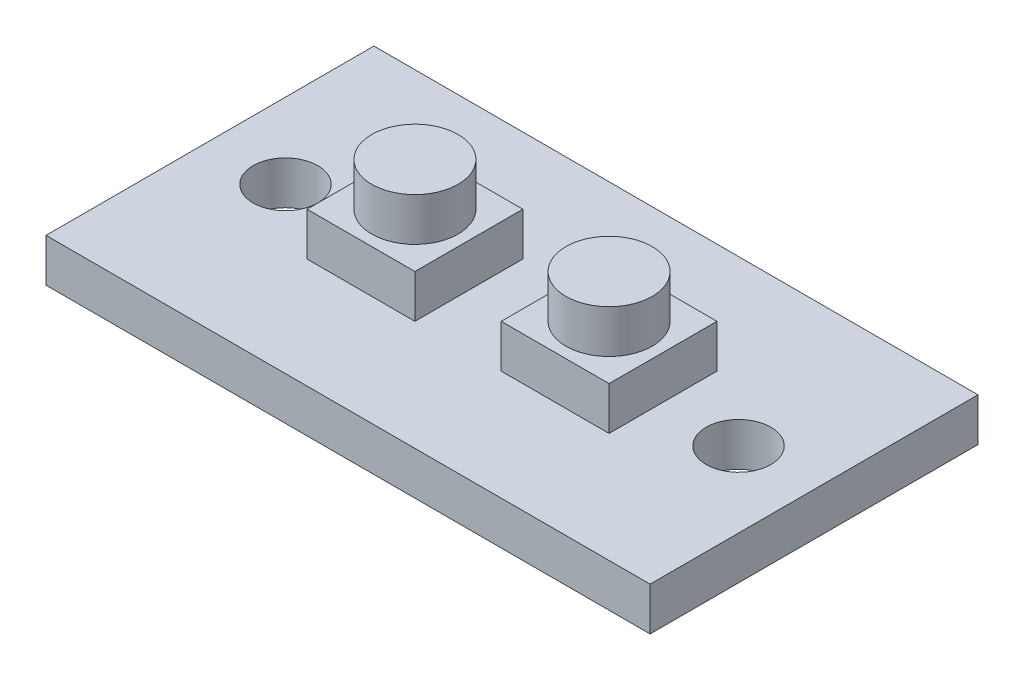
ISO-10303-21;
HEADER;
FILE_DESCRIPTION(('STEP AP214'),'2;1');
FILE_NAME('part.step','',(''),(''),'','','');
FILE_SCHEMA(('AUTOMOTIVE_DESIGN { 1 0 10303 214 1 1 1 1 }'));
ENDSEC;
DATA;
#1=APPLICATION_CONTEXT('core data for automotive mechanical design processes');
#2=APPLICATION_PROTOCOL_DEFINITION('international standard','automotive_design',2000,#1);
#3=PRODUCT_CONTEXT('',#1,'mechanical');
#4=PRODUCT('Part','Part','',(#3));
#5=PRODUCT_RELATED_PRODUCT_CATEGORY('part','',(#4));
#6=PRODUCT_DEFINITION_FORMATION('','',#4);
#7=PRODUCT_DEFINITION_CONTEXT('part definition',#1,'design');
#8=PRODUCT_DEFINITION('design','',#6,#7);
#9=PRODUCT_DEFINITION_SHAPE('','',#8);
#10=(LENGTH_UNIT() NAMED_UNIT(*) SI_UNIT(.MILLI.,.METRE.));
#11=(NAMED_UNIT(*) PLANE_ANGLE_UNIT() SI_UNIT($,.RADIAN.));
#12=(NAMED_UNIT(*) SI_UNIT($,.STERADIAN.) SOLID_ANGLE_UNIT());
#13=UNCERTAINTY_MEASURE_WITH_UNIT(LENGTH_MEASURE(1.E-05),#10,'distance_accuracy_value','');
#14=(GEOMETRIC_REPRESENTATION_CONTEXT(3) GLOBAL_UNCERTAINTY_ASSIGNED_CONTEXT((#13)) GLOBAL_UNIT_ASSIGNED_CONTEXT((#10,
#11,#12)) REPRESENTATION_CONTEXT('',''));
#15=CARTESIAN_POINT('',(0.,0.,0.));
#16=DIRECTION('',(0.,0.,1.));
#17=DIRECTION('',(1.,0.,0.));
#18=AXIS2_PLACEMENT_3D('',#15,#16,#17);
#19=CARTESIAN_POINT('',(0.,2.,0.));
#20=DIRECTION('',(0.,-1.,0.));
#21=DIRECTION('',(0.,0.,-1.));
#22=AXIS2_PLACEMENT_3D('',#19,#20,#21);
#23=PLANE('',#22);
#24=DIRECTION('',(0.,0.,-1.));
#25=VECTOR('',#24,1.);
#26=CARTESIAN_POINT('',(-2.,2.,2.5));
#27=LINE('',#26,#25);
#28=CARTESIAN_POINT('',(-2.,2.,2.5));
#29=VERTEX_POINT('',#28);
#30=CARTESIAN_POINT('',(-2.,2.,-2.5));
#31=VERTEX_POINT('',#30);
#32=EDGE_CURVE('E192',#29,#31,#27,.T.);
#33=ORIENTED_EDGE('',*,*,#32,.F.);
#34=DIRECTION('',(1.,0.,0.));
#35=VECTOR('',#34,1.);
#36=CARTESIAN_POINT('',(-2.,2.,2.5));
#37=LINE('',#36,#35);
#38=CARTESIAN_POINT('',(-7.,2.,2.5));
#39=VERTEX_POINT('',#38);
#40=EDGE_CURVE('E182',#39,#29,#37,.T.);
#41=ORIENTED_EDGE('',*,*,#40,.F.);
#42=DIRECTION('',(0.,0.,1.));
#43=VECTOR('',#42,1.);
#44=CARTESIAN_POINT('',(-7.,2.,2.5));
#45=LINE('',#44,#43);
#46=CARTESIAN_POINT('',(-7.,2.,-2.5));
#47=VERTEX_POINT('',#46);
#48=EDGE_CURVE('E185',#47,#39,#45,.T.);
#49=ORIENTED_EDGE('',*,*,#48,.F.);
#50=DIRECTION('',(-1.,0.,0.));
#51=VECTOR('',#50,1.);
#52=CARTESIAN_POINT('',(-2.,2.,-2.5));
#53=LINE('',#52,#51);
#54=EDGE_CURVE('E189',#31,#47,#53,.T.);
#55=ORIENTED_EDGE('',*,*,#54,.F.);
#56=EDGE_LOOP('',(#33,#41,#49,#55));
#57=FACE_BOUND('',#56,.T.);
#58=DIRECTION('',(0.,0.,-1.));
#59=VECTOR('',#58,1.);
#60=CARTESIAN_POINT('',(14.,2.,7.6));
#61=LINE('',#60,#59);
#62=CARTESIAN_POINT('',(14.,2.,7.6));
#63=VERTEX_POINT('',#62);
#64=CARTESIAN_POINT('',(14.,2.,-7.6));
#65=VERTEX_POINT('',#64);
#66=EDGE_CURVE('E211',#63,#65,#61,.T.);
#67=ORIENTED_EDGE('',*,*,#66,.T.);
#68=DIRECTION('',(-1.,0.,0.));
#69=VECTOR('',#68,1.);
#70=CARTESIAN_POINT('',(-14.,2.,-7.6));
#71=LINE('',#70,#69);
#72=CARTESIAN_POINT('',(-14.,2.,-7.6));
#73=VERTEX_POINT('',#72);
#74=EDGE_CURVE('E214',#65,#73,#71,.T.);
#75=ORIENTED_EDGE('',*,*,#74,.T.);
#76=DIRECTION('',(0.,0.,1.));
#77=VECTOR('',#76,1.);
#78=CARTESIAN_POINT('',(-14.,2.,7.6));
#79=LINE('',#78,#77);
#80=CARTESIAN_POINT('',(-14.,2.,7.6));
#81=VERTEX_POINT('',#80);
#82=EDGE_CURVE('E217',#73,#81,#79,.T.);
#83=ORIENTED_EDGE('',*,*,#82,.T.);
#84=DIRECTION('',(1.,0.,0.));
#85=VECTOR('',#84,1.);
#86=CARTESIAN_POINT('',(-14.,2.,7.6));
#87=LINE('',#86,#85);
#88=EDGE_CURVE('E219',#81,#63,#87,.T.);
#89=ORIENTED_EDGE('',*,*,#88,.T.);
#90=EDGE_LOOP('',(#67,#75,#83,#89));
#91=FACE_BOUND('',#90,.T.);
#92=CARTESIAN_POINT('',(10.5,2.,0.));
#93=DIRECTION('',(0.,1.,0.));
#94=DIRECTION('',(0.,0.,1.));
#95=AXIS2_PLACEMENT_3D('',#92,#93,#94);
#96=CIRCLE('',#95,1.5);
#97=CARTESIAN_POINT('',(10.5,2.,1.5));
#98=VERTEX_POINT('',#97);
#99=EDGE_CURVE('E205',#98,#98,#96,.T.);
#100=ORIENTED_EDGE('',*,*,#99,.F.);
#101=EDGE_LOOP('',(#100));
#102=FACE_BOUND('',#101,.T.);
#103=CARTESIAN_POINT('',(-10.5,2.,0.));
#104=DIRECTION('',(0.,1.,0.));
#105=DIRECTION('',(0.,0.,1.));
#106=AXIS2_PLACEMENT_3D('',#103,#104,#105);
#107=CIRCLE('',#106,1.5);
#108=CARTESIAN_POINT('',(-10.5,2.,1.5));
#109=VERTEX_POINT('',#108);
#110=EDGE_CURVE('E162',#109,#109,#107,.T.);
#111=ORIENTED_EDGE('',*,*,#110,.F.);
#112=EDGE_LOOP('',(#111));
#113=FACE_BOUND('',#112,.T.);
#114=DIRECTION('',(0.,0.,-1.));
#115=VECTOR('',#114,1.);
#116=CARTESIAN_POINT('',(7.,2.,2.5));
#117=LINE('',#116,#115);
#118=CARTESIAN_POINT('',(7.,2.,2.5));
#119=VERTEX_POINT('',#118);
#120=CARTESIAN_POINT('',(7.,2.,-2.5));
#121=VERTEX_POINT('',#120);
#122=EDGE_CURVE('E158',#119,#121,#117,.T.);
#123=ORIENTED_EDGE('',*,*,#122,.F.);
#124=DIRECTION('',(1.,0.,0.));
#125=VECTOR('',#124,1.);
#126=CARTESIAN_POINT('',(2.,2.,2.5));
#127=LINE('',#126,#125);
#128=CARTESIAN_POINT('',(2.,2.,2.5));
#129=VERTEX_POINT('',#128);
#130=EDGE_CURVE('E155',#129,#119,#127,.T.);
#131=ORIENTED_EDGE('',*,*,#130,.F.);
#132=DIRECTION('',(0.,0.,1.));
#133=VECTOR('',#132,1.);
#134=CARTESIAN_POINT('',(2.,2.,2.5));
#135=LINE('',#134,#133);
#136=CARTESIAN_POINT('',(2.,2.,-2.5));
#137=VERTEX_POINT('',#136);
#138=EDGE_CURVE('E69',#137,#129,#135,.T.);
#139=ORIENTED_EDGE('',*,*,#138,.F.);
#140=DIRECTION('',(-1.,0.,0.));
#141=VECTOR('',#140,1.);
#142=CARTESIAN_POINT('',(2.,2.,-2.5));
#143=LINE('',#142,#141);
#144=EDGE_CURVE('E64',#121,#137,#143,.T.);
#145=ORIENTED_EDGE('',*,*,#144,.F.);
#146=EDGE_LOOP('',(#123,#131,#139,#145));
#147=FACE_BOUND('',#146,.T.);
#148=ADVANCED_FACE('F47',(#57,#91,#102,#113,#147),#23,.F.);
#149=CARTESIAN_POINT('',(0.,0.,0.));
#150=DIRECTION('',(0.,-1.,0.));
#151=DIRECTION('',(0.,0.,-1.));
#152=AXIS2_PLACEMENT_3D('',#149,#150,#151);
#153=PLANE('',#152);
#154=CARTESIAN_POINT('',(10.5,0.,0.));
#155=DIRECTION('',(0.,1.,0.));
#156=DIRECTION('',(0.,0.,1.));
#157=AXIS2_PLACEMENT_3D('',#154,#155,#156);
#158=CIRCLE('',#157,1.5);
#159=CARTESIAN_POINT('',(10.5,0.,1.5));
#160=VERTEX_POINT('',#159);
#161=EDGE_CURVE('E203',#160,#160,#158,.T.);
#162=ORIENTED_EDGE('',*,*,#161,.T.);
#163=EDGE_LOOP('',(#162));
#164=FACE_BOUND('',#163,.T.);
#165=DIRECTION('',(0.,0.,-1.));
#166=VECTOR('',#165,1.);
#167=CARTESIAN_POINT('',(14.,0.,7.6));
#168=LINE('',#167,#166);
#169=CARTESIAN_POINT('',(14.,0.,7.6));
#170=VERTEX_POINT('',#169);
#171=CARTESIAN_POINT('',(14.,0.,-7.6));
#172=VERTEX_POINT('',#171);
#173=EDGE_CURVE('E208',#170,#172,#168,.T.);
#174=ORIENTED_EDGE('',*,*,#173,.F.);
#175=DIRECTION('',(1.,0.,0.));
#176=VECTOR('',#175,1.);
#177=CARTESIAN_POINT('',(-14.,0.,7.6));
#178=LINE('',#177,#176);
#179=CARTESIAN_POINT('',(-14.,0.,7.6));
#180=VERTEX_POINT('',#179);
#181=EDGE_CURVE('E215',#180,#170,#178,.T.);
#182=ORIENTED_EDGE('',*,*,#181,.F.);
#183=DIRECTION('',(0.,0.,1.));
#184=VECTOR('',#183,1.);
#185=CARTESIAN_POINT('',(-14.,0.,7.6));
#186=LINE('',#185,#184);
#187=CARTESIAN_POINT('',(-14.,0.,-7.6));
#188=VERTEX_POINT('',#187);
#189=EDGE_CURVE('E226',#188,#180,#186,.T.);
#190=ORIENTED_EDGE('',*,*,#189,.F.);
#191=DIRECTION('',(-1.,0.,0.));
#192=VECTOR('',#191,1.);
#193=CARTESIAN_POINT('',(-14.,0.,-7.6));
#194=LINE('',#193,#192);
#195=EDGE_CURVE('E224',#172,#188,#194,.T.);
#196=ORIENTED_EDGE('',*,*,#195,.F.);
#197=EDGE_LOOP('',(#174,#182,#190,#196));
#198=FACE_BOUND('',#197,.T.);
#199=CARTESIAN_POINT('',(-10.5,0.,0.));
#200=DIRECTION('',(0.,1.,0.));
#201=DIRECTION('',(0.,0.,1.));
#202=AXIS2_PLACEMENT_3D('',#199,#200,#201);
#203=CIRCLE('',#202,1.5);
#204=CARTESIAN_POINT('',(-10.5,0.,1.5));
#205=VERTEX_POINT('',#204);
#206=EDGE_CURVE('E159',#205,#205,#203,.T.);
#207=ORIENTED_EDGE('',*,*,#206,.T.);
#208=EDGE_LOOP('',(#207));
#209=FACE_BOUND('',#208,.T.);
#210=ADVANCED_FACE('F274',(#164,#198,#209),#153,.T.);
#211=CARTESIAN_POINT('',(14.,2.,7.6));
#212=DIRECTION('',(-1.,0.,0.));
#213=DIRECTION('',(0.,0.,1.));
#214=AXIS2_PLACEMENT_3D('',#211,#212,#213);
#215=PLANE('',#214);
#216=ORIENTED_EDGE('',*,*,#173,.T.);
#217=DIRECTION('',(0.,-1.,0.));
#218=VECTOR('',#217,1.);
#219=CARTESIAN_POINT('',(14.,2.,-7.6));
#220=LINE('',#219,#218);
#221=EDGE_CURVE('E51',#65,#172,#220,.T.);
#222=ORIENTED_EDGE('',*,*,#221,.F.);
#223=ORIENTED_EDGE('',*,*,#66,.F.);
#224=DIRECTION('',(0.,-1.,0.));
#225=VECTOR('',#224,1.);
#226=CARTESIAN_POINT('',(14.,2.,7.6));
#227=LINE('',#226,#225);
#228=EDGE_CURVE('E221',#63,#170,#227,.T.);
#229=ORIENTED_EDGE('',*,*,#228,.T.);
#230=EDGE_LOOP('',(#216,#222,#223,#229));
#231=FACE_BOUND('',#230,.T.);
#232=ADVANCED_FACE('F49',(#231),#215,.F.);
#233=CARTESIAN_POINT('',(-14.,2.,-7.6));
#234=DIRECTION('',(0.,0.,1.));
#235=DIRECTION('',(1.,0.,0.));
#236=AXIS2_PLACEMENT_3D('',#233,#234,#235);
#237=PLANE('',#236);
#238=ORIENTED_EDGE('',*,*,#195,.T.);
#239=DIRECTION('',(0.,-1.,0.));
#240=VECTOR('',#239,1.);
#241=CARTESIAN_POINT('',(-14.,2.,-7.6));
#242=LINE('',#241,#240);
#243=EDGE_CURVE('E233',#73,#188,#242,.T.);
#244=ORIENTED_EDGE('',*,*,#243,.F.);
#245=ORIENTED_EDGE('',*,*,#74,.F.);
#246=ORIENTED_EDGE('',*,*,#221,.T.);
#247=EDGE_LOOP('',(#238,#244,#245,#246));
#248=FACE_BOUND('',#247,.T.);
#249=ADVANCED_FACE('F293',(#248),#237,.F.);
#250=CARTESIAN_POINT('',(-14.,2.,7.6));
#251=DIRECTION('',(1.,0.,0.));
#252=DIRECTION('',(0.,0.,-1.));
#253=AXIS2_PLACEMENT_3D('',#250,#251,#252);
#254=PLANE('',#253);
#255=ORIENTED_EDGE('',*,*,#189,.T.);
#256=DIRECTION('',(0.,-1.,0.));
#257=VECTOR('',#256,1.);
#258=CARTESIAN_POINT('',(-14.,2.,7.6));
#259=LINE('',#258,#257);
#260=EDGE_CURVE('E231',#81,#180,#259,.T.);
#261=ORIENTED_EDGE('',*,*,#260,.F.);
#262=ORIENTED_EDGE('',*,*,#82,.F.);
#263=ORIENTED_EDGE('',*,*,#243,.T.);
#264=EDGE_LOOP('',(#255,#261,#262,#263));
#265=FACE_BOUND('',#264,.T.);
#266=ADVANCED_FACE('F290',(#265),#254,.F.);
#267=CARTESIAN_POINT('',(-14.,2.,7.6));
#268=DIRECTION('',(0.,0.,-1.));
#269=DIRECTION('',(-1.,0.,0.));
#270=AXIS2_PLACEMENT_3D('',#267,#268,#269);
#271=PLANE('',#270);
#272=ORIENTED_EDGE('',*,*,#181,.T.);
#273=ORIENTED_EDGE('',*,*,#228,.F.);
#274=ORIENTED_EDGE('',*,*,#88,.F.);
#275=ORIENTED_EDGE('',*,*,#260,.T.);
#276=EDGE_LOOP('',(#272,#273,#274,#275));
#277=FACE_BOUND('',#276,.T.);
#278=ADVANCED_FACE('F287',(#277),#271,.F.);
#279=CARTESIAN_POINT('',(10.5,2.,0.));
#280=DIRECTION('',(0.,-1.,0.));
#281=DIRECTION('',(0.,0.,-1.));
#282=AXIS2_PLACEMENT_3D('',#279,#280,#281);
#283=CYLINDRICAL_SURFACE('',#282,1.5);
#284=ORIENTED_EDGE('',*,*,#99,.T.);
#285=EDGE_LOOP('',(#284));
#286=FACE_BOUND('',#285,.T.);
#287=ORIENTED_EDGE('',*,*,#161,.F.);
#288=EDGE_LOOP('',(#287));
#289=FACE_BOUND('',#288,.T.);
#290=ADVANCED_FACE('F284',(#286,#289),#283,.F.);
#291=CARTESIAN_POINT('',(-10.5,2.,0.));
#292=DIRECTION('',(0.,-1.,0.));
#293=DIRECTION('',(0.,0.,-1.));
#294=AXIS2_PLACEMENT_3D('',#291,#292,#293);
#295=CYLINDRICAL_SURFACE('',#294,1.5);
#296=ORIENTED_EDGE('',*,*,#110,.T.);
#297=EDGE_LOOP('',(#296));
#298=FACE_BOUND('',#297,.T.);
#299=ORIENTED_EDGE('',*,*,#206,.F.);
#300=EDGE_LOOP('',(#299));
#301=FACE_BOUND('',#300,.T.);
#302=ADVANCED_FACE('F312',(#298,#301),#295,.F.);
#303=CARTESIAN_POINT('',(-2.,4.,2.5));
#304=DIRECTION('',(-1.,0.,0.));
#305=DIRECTION('',(0.,0.,1.));
#306=AXIS2_PLACEMENT_3D('',#303,#304,#305);
#307=PLANE('',#306);
#308=ORIENTED_EDGE('',*,*,#32,.T.);
#309=DIRECTION('',(0.,-1.,0.));
#310=VECTOR('',#309,1.);
#311=CARTESIAN_POINT('',(-2.,4.,-2.5));
#312=LINE('',#311,#310);
#313=CARTESIAN_POINT('',(-2.,4.,-2.5));
#314=VERTEX_POINT('',#313);
#315=EDGE_CURVE('E168',#314,#31,#312,.T.);
#316=ORIENTED_EDGE('',*,*,#315,.F.);
#317=DIRECTION('',(0.,0.,-1.));
#318=VECTOR('',#317,1.);
#319=CARTESIAN_POINT('',(-2.,4.,2.5));
#320=LINE('',#319,#318);
#321=CARTESIAN_POINT('',(-2.,4.,2.5));
#322=VERTEX_POINT('',#321);
#323=EDGE_CURVE('E186',#322,#314,#320,.T.);
#324=ORIENTED_EDGE('',*,*,#323,.F.);
#325=DIRECTION('',(0.,-1.,0.));
#326=VECTOR('',#325,1.);
#327=CARTESIAN_POINT('',(-2.,4.,2.5));
#328=LINE('',#327,#326);
#329=EDGE_CURVE('E178',#322,#29,#328,.T.);
#330=ORIENTED_EDGE('',*,*,#329,.T.);
#331=EDGE_LOOP('',(#308,#316,#324,#330));
#332=FACE_BOUND('',#331,.T.);
#333=ADVANCED_FACE('F315',(#332),#307,.F.);
#334=CARTESIAN_POINT('',(-2.,4.,-2.5));
#335=DIRECTION('',(0.,0.,1.));
#336=DIRECTION('',(1.,0.,0.));
#337=AXIS2_PLACEMENT_3D('',#334,#335,#336);
#338=PLANE('',#337);
#339=ORIENTED_EDGE('',*,*,#54,.T.);
#340=DIRECTION('',(0.,-1.,0.));
#341=VECTOR('',#340,1.);
#342=CARTESIAN_POINT('',(-7.,4.,-2.5));
#343=LINE('',#342,#341);
#344=CARTESIAN_POINT('',(-7.,4.,-2.5));
#345=VERTEX_POINT('',#344);
#346=EDGE_CURVE('E171',#345,#47,#343,.T.);
#347=ORIENTED_EDGE('',*,*,#346,.F.);
#348=DIRECTION('',(-1.,0.,0.));
#349=VECTOR('',#348,1.);
#350=CARTESIAN_POINT('',(-2.,4.,-2.5));
#351=LINE('',#350,#349);
#352=EDGE_CURVE('E198',#314,#345,#351,.T.);
#353=ORIENTED_EDGE('',*,*,#352,.F.);
#354=ORIENTED_EDGE('',*,*,#315,.T.);
#355=EDGE_LOOP('',(#339,#347,#353,#354));
#356=FACE_BOUND('',#355,.T.);
#357=ADVANCED_FACE('F321',(#356),#338,.F.);
#358=CARTESIAN_POINT('',(-7.,4.,2.5));
#359=DIRECTION('',(1.,0.,0.));
#360=DIRECTION('',(0.,0.,-1.));
#361=AXIS2_PLACEMENT_3D('',#358,#359,#360);
#362=PLANE('',#361);
#363=ORIENTED_EDGE('',*,*,#48,.T.);
#364=DIRECTION('',(0.,-1.,0.));
#365=VECTOR('',#364,1.);
#366=CARTESIAN_POINT('',(-7.,4.,2.5));
#367=LINE('',#366,#365);
#368=CARTESIAN_POINT('',(-7.,4.,2.5));
#369=VERTEX_POINT('',#368);
#370=EDGE_CURVE('E175',#369,#39,#367,.T.);
#371=ORIENTED_EDGE('',*,*,#370,.F.);
#372=DIRECTION('',(0.,0.,1.));
#373=VECTOR('',#372,1.);
#374=CARTESIAN_POINT('',(-7.,4.,2.5));
#375=LINE('',#374,#373);
#376=EDGE_CURVE('E196',#345,#369,#375,.T.);
#377=ORIENTED_EDGE('',*,*,#376,.F.);
#378=ORIENTED_EDGE('',*,*,#346,.T.);
#379=EDGE_LOOP('',(#363,#371,#377,#378));
#380=FACE_BOUND('',#379,.T.);
#381=ADVANCED_FACE('F333',(#380),#362,.F.);
#382=CARTESIAN_POINT('',(-2.,4.,2.5));
#383=DIRECTION('',(0.,0.,-1.));
#384=DIRECTION('',(-1.,0.,0.));
#385=AXIS2_PLACEMENT_3D('',#382,#383,#384);
#386=PLANE('',#385);
#387=ORIENTED_EDGE('',*,*,#40,.T.);
#388=ORIENTED_EDGE('',*,*,#329,.F.);
#389=DIRECTION('',(1.,0.,0.));
#390=VECTOR('',#389,1.);
#391=CARTESIAN_POINT('',(-2.,4.,2.5));
#392=LINE('',#391,#390);
#393=EDGE_CURVE('E181',#369,#322,#392,.T.);
#394=ORIENTED_EDGE('',*,*,#393,.F.);
#395=ORIENTED_EDGE('',*,*,#370,.T.);
#396=EDGE_LOOP('',(#387,#388,#394,#395));
#397=FACE_BOUND('',#396,.T.);
#398=ADVANCED_FACE('F329',(#397),#386,.F.);
#399=CARTESIAN_POINT('',(0.,4.,0.));
#400=DIRECTION('',(0.,1.,0.));
#401=DIRECTION('',(0.,0.,1.));
#402=AXIS2_PLACEMENT_3D('',#399,#400,#401);
#403=PLANE('',#402);
#404=CARTESIAN_POINT('',(-4.5,4.,0.));
#405=DIRECTION('',(0.,1.,0.));
#406=DIRECTION('',(0.,0.,-1.));
#407=AXIS2_PLACEMENT_3D('',#404,#405,#406);
#408=CIRCLE('',#407,2.);
#409=CARTESIAN_POINT('',(-4.5,4.,-2.));
#410=VERTEX_POINT('',#409);
#411=EDGE_CURVE('E11',#410,#410,#408,.T.);
#412=ORIENTED_EDGE('',*,*,#411,.F.);
#413=EDGE_LOOP('',(#412));
#414=FACE_BOUND('',#413,.T.);
#415=ORIENTED_EDGE('',*,*,#323,.T.);
#416=ORIENTED_EDGE('',*,*,#352,.T.);
#417=ORIENTED_EDGE('',*,*,#376,.T.);
#418=ORIENTED_EDGE('',*,*,#393,.T.);
#419=EDGE_LOOP('',(#415,#416,#417,#418));
#420=FACE_BOUND('',#419,.T.);
#421=ADVANCED_FACE('F326',(#414,#420),#403,.T.);
#422=CARTESIAN_POINT('',(7.,4.,2.5));
#423=DIRECTION('',(-1.,0.,0.));
#424=DIRECTION('',(0.,0.,1.));
#425=AXIS2_PLACEMENT_3D('',#422,#423,#424);
#426=PLANE('',#425);
#427=ORIENTED_EDGE('',*,*,#122,.T.);
#428=DIRECTION('',(0.,-1.,0.));
#429=VECTOR('',#428,1.);
#430=CARTESIAN_POINT('',(7.,4.,-2.5));
#431=LINE('',#430,#429);
#432=CARTESIAN_POINT('',(7.,4.,-2.5));
#433=VERTEX_POINT('',#432);
#434=EDGE_CURVE('E139',#433,#121,#431,.T.);
#435=ORIENTED_EDGE('',*,*,#434,.F.);
#436=DIRECTION('',(0.,0.,-1.));
#437=VECTOR('',#436,1.);
#438=CARTESIAN_POINT('',(7.,4.,2.5));
#439=LINE('',#438,#437);
#440=CARTESIAN_POINT('',(7.,4.,2.5));
#441=VERTEX_POINT('',#440);
#442=EDGE_CURVE('E146',#441,#433,#439,.T.);
#443=ORIENTED_EDGE('',*,*,#442,.F.);
#444=DIRECTION('',(0.,-1.,0.));
#445=VECTOR('',#444,1.);
#446=CARTESIAN_POINT('',(7.,4.,2.5));
#447=LINE('',#446,#445);
#448=EDGE_CURVE('E253',#441,#119,#447,.T.);
#449=ORIENTED_EDGE('',*,*,#448,.T.);
#450=EDGE_LOOP('',(#427,#435,#443,#449));
#451=FACE_BOUND('',#450,.T.);
#452=ADVANCED_FACE('F157',(#451),#426,.F.);
#453=CARTESIAN_POINT('',(2.,4.,-2.5));
#454=DIRECTION('',(0.,0.,1.));
#455=DIRECTION('',(1.,0.,0.));
#456=AXIS2_PLACEMENT_3D('',#453,#454,#455);
#457=PLANE('',#456);
#458=ORIENTED_EDGE('',*,*,#144,.T.);
#459=DIRECTION('',(0.,-1.,0.));
#460=VECTOR('',#459,1.);
#461=CARTESIAN_POINT('',(2.,4.,-2.5));
#462=LINE('',#461,#460);
#463=CARTESIAN_POINT('',(2.,4.,-2.5));
#464=VERTEX_POINT('',#463);
#465=EDGE_CURVE('E142',#464,#137,#462,.T.);
#466=ORIENTED_EDGE('',*,*,#465,.F.);
#467=DIRECTION('',(-1.,0.,0.));
#468=VECTOR('',#467,1.);
#469=CARTESIAN_POINT('',(2.,4.,-2.5));
#470=LINE('',#469,#468);
#471=EDGE_CURVE('E135',#433,#464,#470,.T.);
#472=ORIENTED_EDGE('',*,*,#471,.F.);
#473=ORIENTED_EDGE('',*,*,#434,.T.);
#474=EDGE_LOOP('',(#458,#466,#472,#473));
#475=FACE_BOUND('',#474,.T.);
#476=ADVANCED_FACE('F137',(#475),#457,.F.);
#477=CARTESIAN_POINT('',(2.,4.,2.5));
#478=DIRECTION('',(1.,0.,0.));
#479=DIRECTION('',(0.,0.,-1.));
#480=AXIS2_PLACEMENT_3D('',#477,#478,#479);
#481=PLANE('',#480);
#482=ORIENTED_EDGE('',*,*,#138,.T.);
#483=DIRECTION('',(0.,-1.,0.));
#484=VECTOR('',#483,1.);
#485=CARTESIAN_POINT('',(2.,4.,2.5));
#486=LINE('',#485,#484);
#487=CARTESIAN_POINT('',(2.,4.,2.5));
#488=VERTEX_POINT('',#487);
#489=EDGE_CURVE('E164',#488,#129,#486,.T.);
#490=ORIENTED_EDGE('',*,*,#489,.F.);
#491=DIRECTION('',(0.,0.,1.));
#492=VECTOR('',#491,1.);
#493=CARTESIAN_POINT('',(2.,4.,2.5));
#494=LINE('',#493,#492);
#495=EDGE_CURVE('E145',#464,#488,#494,.T.);
#496=ORIENTED_EDGE('',*,*,#495,.F.);
#497=ORIENTED_EDGE('',*,*,#465,.T.);
#498=EDGE_LOOP('',(#482,#490,#496,#497));
#499=FACE_BOUND('',#498,.T.);
#500=ADVANCED_FACE('F264',(#499),#481,.F.);
#501=CARTESIAN_POINT('',(2.,4.,2.5));
#502=DIRECTION('',(0.,0.,-1.));
#503=DIRECTION('',(-1.,0.,0.));
#504=AXIS2_PLACEMENT_3D('',#501,#502,#503);
#505=PLANE('',#504);
#506=ORIENTED_EDGE('',*,*,#130,.T.);
#507=ORIENTED_EDGE('',*,*,#448,.F.);
#508=DIRECTION('',(1.,0.,0.));
#509=VECTOR('',#508,1.);
#510=CARTESIAN_POINT('',(2.,4.,2.5));
#511=LINE('',#510,#509);
#512=EDGE_CURVE('E151',#488,#441,#511,.T.);
#513=ORIENTED_EDGE('',*,*,#512,.F.);
#514=ORIENTED_EDGE('',*,*,#489,.T.);
#515=EDGE_LOOP('',(#506,#507,#513,#514));
#516=FACE_BOUND('',#515,.T.);
#517=ADVANCED_FACE('F262',(#516),#505,.F.);
#518=CARTESIAN_POINT('',(0.,4.,0.));
#519=DIRECTION('',(0.,-1.,0.));
#520=DIRECTION('',(0.,0.,-1.));
#521=AXIS2_PLACEMENT_3D('',#518,#519,#520);
#522=PLANE('',#521);
#523=CARTESIAN_POINT('',(4.5,4.,0.));
#524=DIRECTION('',(0.,1.,0.));
#525=DIRECTION('',(0.,0.,1.));
#526=AXIS2_PLACEMENT_3D('',#523,#524,#525);
#527=CIRCLE('',#526,2.);
#528=CARTESIAN_POINT('',(4.5,4.,2.));
#529=VERTEX_POINT('',#528);
#530=EDGE_CURVE('E56',#529,#529,#527,.T.);
#531=ORIENTED_EDGE('',*,*,#530,.F.);
#532=EDGE_LOOP('',(#531));
#533=FACE_BOUND('',#532,.T.);
#534=ORIENTED_EDGE('',*,*,#442,.T.);
#535=ORIENTED_EDGE('',*,*,#471,.T.);
#536=ORIENTED_EDGE('',*,*,#495,.T.);
#537=ORIENTED_EDGE('',*,*,#512,.T.);
#538=EDGE_LOOP('',(#534,#535,#536,#537));
#539=FACE_BOUND('',#538,.T.);
#540=ADVANCED_FACE('F149',(#533,#539),#522,.F.);
#541=CARTESIAN_POINT('',(4.5,6.,0.));
#542=DIRECTION('',(0.,-1.,0.));
#543=DIRECTION('',(0.,0.,-1.));
#544=AXIS2_PLACEMENT_3D('',#541,#542,#543);
#545=CYLINDRICAL_SURFACE('',#544,2.);
#546=CARTESIAN_POINT('',(4.5,6.,0.));
#547=DIRECTION('',(0.,1.,0.));
#548=DIRECTION('',(0.,0.,1.));
#549=AXIS2_PLACEMENT_3D('',#546,#547,#548);
#550=CIRCLE('',#549,2.);
#551=CARTESIAN_POINT('',(4.5,6.,2.));
#552=VERTEX_POINT('',#551);
#553=EDGE_CURVE('E172',#552,#552,#550,.T.);
#554=ORIENTED_EDGE('',*,*,#553,.F.);
#555=EDGE_LOOP('',(#554));
#556=FACE_BOUND('',#555,.T.);
#557=ORIENTED_EDGE('',*,*,#530,.T.);
#558=EDGE_LOOP('',(#557));
#559=FACE_BOUND('',#558,.T.);
#560=ADVANCED_FACE('F369',(#556,#559),#545,.T.);
#561=CARTESIAN_POINT('',(4.5,6.,0.));
#562=DIRECTION('',(0.,1.,0.));
#563=DIRECTION('',(0.,0.,1.));
#564=AXIS2_PLACEMENT_3D('',#561,#562,#563);
#565=PLANE('',#564);
#566=ORIENTED_EDGE('',*,*,#553,.T.);
#567=EDGE_LOOP('',(#566));
#568=FACE_BOUND('',#567,.T.);
#569=ADVANCED_FACE('F384',(#568),#565,.T.);
#570=CARTESIAN_POINT('',(-4.5,6.,0.));
#571=DIRECTION('',(0.,-1.,0.));
#572=DIRECTION('',(0.,0.,-1.));
#573=AXIS2_PLACEMENT_3D('',#570,#571,#572);
#574=CYLINDRICAL_SURFACE('',#573,2.);
#575=CARTESIAN_POINT('',(-4.5,6.,0.));
#576=DIRECTION('',(0.,1.,0.));
#577=DIRECTION('',(0.,0.,-1.));
#578=AXIS2_PLACEMENT_3D('',#575,#576,#577);
#579=CIRCLE('',#578,2.);
#580=CARTESIAN_POINT('',(-4.5,6.,-2.));
#581=VERTEX_POINT('',#580);
#582=EDGE_CURVE('E248',#581,#581,#579,.T.);
#583=ORIENTED_EDGE('',*,*,#582,.F.);
#584=EDGE_LOOP('',(#583));
#585=FACE_BOUND('',#584,.T.);
#586=ORIENTED_EDGE('',*,*,#411,.T.);
#587=EDGE_LOOP('',(#586));
#588=FACE_BOUND('',#587,.T.);
#589=ADVANCED_FACE('F393',(#585,#588),#574,.T.);
#590=CARTESIAN_POINT('',(-4.5,6.,0.));
#591=DIRECTION('',(0.,-1.,0.));
#592=DIRECTION('',(0.,0.,-1.));
#593=AXIS2_PLACEMENT_3D('',#590,#591,#592);
#594=PLANE('',#593);
#595=ORIENTED_EDGE('',*,*,#582,.T.);
#596=EDGE_LOOP('',(#595));
#597=FACE_BOUND('',#596,.T.);
#598=ADVANCED_FACE('F402',(#597),#594,.F.);
#599=CLOSED_SHELL('',(#148,#210,#232,#249,#266,#278,#290,#302,#333,#357,#381,#398,#421,#452,
#476,#500,#517,#540,#560,#569,#589,#598));
#600=MANIFOLD_SOLID_BREP('B2',#599);
#601=ADVANCED_BREP_SHAPE_REPRESENTATION('',(#18,#600),#14);
#602=SHAPE_DEFINITION_REPRESENTATION(#9,#601);
ENDSEC;
END-ISO-10303-21;
